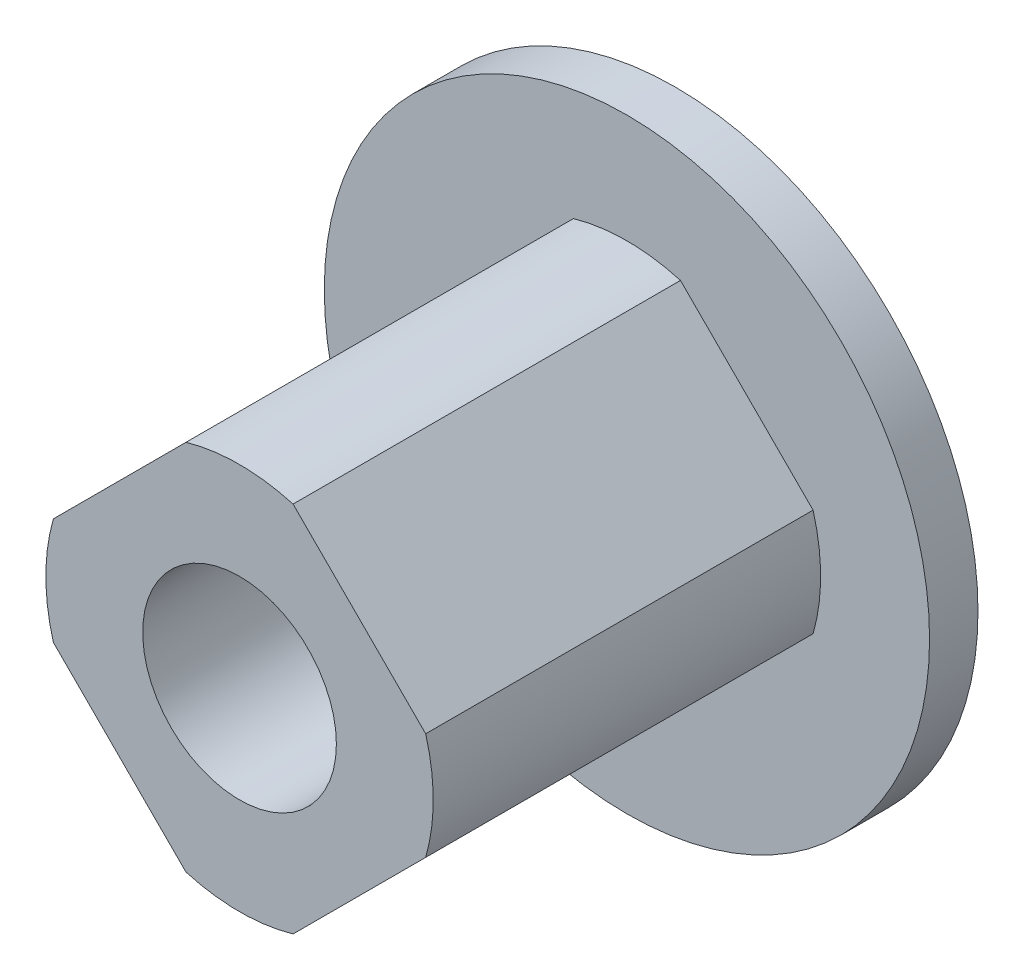
ISO-10303-21;
HEADER;
FILE_DESCRIPTION(('STEP AP214'),'2;1');
FILE_NAME('part.step','',(''),(''),'','','');
FILE_SCHEMA(('AUTOMOTIVE_DESIGN { 1 0 10303 214 1 1 1 1 }'));
ENDSEC;
DATA;
#1=APPLICATION_CONTEXT('core data for automotive mechanical design processes');
#2=APPLICATION_PROTOCOL_DEFINITION('international standard','automotive_design',2000,#1);
#3=PRODUCT_CONTEXT('',#1,'mechanical');
#4=PRODUCT('Part','Part','',(#3));
#5=PRODUCT_RELATED_PRODUCT_CATEGORY('part','',(#4));
#6=PRODUCT_DEFINITION_FORMATION('','',#4);
#7=PRODUCT_DEFINITION_CONTEXT('part definition',#1,'design');
#8=PRODUCT_DEFINITION('design','',#6,#7);
#9=PRODUCT_DEFINITION_SHAPE('','',#8);
#10=(LENGTH_UNIT() NAMED_UNIT(*) SI_UNIT(.MILLI.,.METRE.));
#11=(NAMED_UNIT(*) PLANE_ANGLE_UNIT() SI_UNIT($,.RADIAN.));
#12=(NAMED_UNIT(*) SI_UNIT($,.STERADIAN.) SOLID_ANGLE_UNIT());
#13=UNCERTAINTY_MEASURE_WITH_UNIT(LENGTH_MEASURE(1.E-05),#10,'distance_accuracy_value','');
#14=(GEOMETRIC_REPRESENTATION_CONTEXT(3) GLOBAL_UNCERTAINTY_ASSIGNED_CONTEXT((#13)) GLOBAL_UNIT_ASSIGNED_CONTEXT((#10,
#11,#12)) REPRESENTATION_CONTEXT('',''));
#15=CARTESIAN_POINT('',(0.,0.,0.));
#16=DIRECTION('',(0.,0.,1.));
#17=DIRECTION('',(1.,0.,0.));
#18=AXIS2_PLACEMENT_3D('',#15,#16,#17);
#19=CARTESIAN_POINT('',(0.,0.,31.75));
#20=DIRECTION('',(0.,0.,1.));
#21=DIRECTION('',(1.,0.,0.));
#22=AXIS2_PLACEMENT_3D('',#19,#20,#21);
#23=PLANE('',#22);
#24=CARTESIAN_POINT('',(0.,0.,31.75));
#25=DIRECTION('',(0.,0.,1.));
#26=DIRECTION('',(1.,0.,0.));
#27=AXIS2_PLACEMENT_3D('',#24,#25,#26);
#28=CIRCLE('',#27,6.35);
#29=CARTESIAN_POINT('',(6.35,0.,31.75));
#30=VERTEX_POINT('',#29);
#31=EDGE_CURVE('E167',#30,#30,#28,.T.);
#32=ORIENTED_EDGE('',*,*,#31,.F.);
#33=EDGE_LOOP('',(#32));
#34=FACE_BOUND('',#33,.T.);
#35=CARTESIAN_POINT('',(0.,0.,31.75));
#36=DIRECTION('',(0.,0.,1.));
#37=DIRECTION('',(1.,0.,0.));
#38=AXIS2_PLACEMENT_3D('',#35,#36,#37);
#39=CIRCLE('',#38,12.7);
#40=CARTESIAN_POINT('',(12.2052719061328,-3.51017630573826,31.75));
#41=VERTEX_POINT('',#40);
#42=CARTESIAN_POINT('',(12.2052719061328,3.51017630573825,31.75));
#43=VERTEX_POINT('',#42);
#44=EDGE_CURVE('E151',#41,#43,#39,.T.);
#45=ORIENTED_EDGE('',*,*,#44,.T.);
#46=DIRECTION('',(-0.707106781186548,0.707106781186547,0.));
#47=VECTOR('',#46,1.);
#48=CARTESIAN_POINT('',(15.715448211871,0.,31.75));
#49=LINE('',#48,#47);
#50=CARTESIAN_POINT('',(3.51017630573825,12.2052719061328,31.75));
#51=VERTEX_POINT('',#50);
#52=EDGE_CURVE('E134',#43,#51,#49,.T.);
#53=ORIENTED_EDGE('',*,*,#52,.T.);
#54=CARTESIAN_POINT('',(-3.51017630573825,12.2052719061328,31.75));
#55=VERTEX_POINT('',#54);
#56=EDGE_CURVE('E141',#51,#55,#39,.T.);
#57=ORIENTED_EDGE('',*,*,#56,.T.);
#58=DIRECTION('',(-0.707106781186547,-0.707106781186547,0.));
#59=VECTOR('',#58,1.);
#60=CARTESIAN_POINT('',(0.,15.715448211871,31.75));
#61=LINE('',#60,#59);
#62=CARTESIAN_POINT('',(-12.2052719061328,3.51017630573825,31.75));
#63=VERTEX_POINT('',#62);
#64=EDGE_CURVE('E122',#55,#63,#61,.T.);
#65=ORIENTED_EDGE('',*,*,#64,.T.);
#66=CARTESIAN_POINT('',(-12.2052719061328,-3.51017630573825,31.75));
#67=VERTEX_POINT('',#66);
#68=EDGE_CURVE('E149',#63,#67,#39,.T.);
#69=ORIENTED_EDGE('',*,*,#68,.T.);
#70=DIRECTION('',(0.707106781186547,-0.707106781186548,0.));
#71=VECTOR('',#70,1.);
#72=CARTESIAN_POINT('',(-15.715448211871,0.,31.75));
#73=LINE('',#72,#71);
#74=CARTESIAN_POINT('',(-3.51017630573826,-12.2052719061328,31.75));
#75=VERTEX_POINT('',#74);
#76=EDGE_CURVE('E133',#67,#75,#73,.T.);
#77=ORIENTED_EDGE('',*,*,#76,.T.);
#78=CARTESIAN_POINT('',(3.51017630573826,-12.2052719061328,31.75));
#79=VERTEX_POINT('',#78);
#80=EDGE_CURVE('E155',#75,#79,#39,.T.);
#81=ORIENTED_EDGE('',*,*,#80,.T.);
#82=DIRECTION('',(0.707106781186547,0.707106781186547,0.));
#83=VECTOR('',#82,1.);
#84=CARTESIAN_POINT('',(0.,-15.715448211871,31.75));
#85=LINE('',#84,#83);
#86=EDGE_CURVE('E195',#79,#41,#85,.T.);
#87=ORIENTED_EDGE('',*,*,#86,.T.);
#88=EDGE_LOOP('',(#45,#53,#57,#65,#69,#77,#81,#87));
#89=FACE_BOUND('',#88,.T.);
#90=ADVANCED_FACE('F35',(#34,#89),#23,.T.);
#91=CARTESIAN_POINT('',(0.,0.,31.75));
#92=DIRECTION('',(0.,0.,-1.));
#93=DIRECTION('',(-1.,0.,0.));
#94=AXIS2_PLACEMENT_3D('',#91,#92,#93);
#95=CYLINDRICAL_SURFACE('',#94,12.7);
#96=DIRECTION('',(0.,0.,-1.));
#97=VECTOR('',#96,1.);
#98=CARTESIAN_POINT('',(12.2052719061328,3.51017630573825,31.75));
#99=LINE('',#98,#97);
#100=CARTESIAN_POINT('',(12.2052719061328,3.51017630573825,6.35));
#101=VERTEX_POINT('',#100);
#102=EDGE_CURVE('E11',#43,#101,#99,.T.);
#103=ORIENTED_EDGE('',*,*,#102,.F.);
#104=ORIENTED_EDGE('',*,*,#44,.F.);
#105=DIRECTION('',(0.,0.,-1.));
#106=VECTOR('',#105,1.);
#107=CARTESIAN_POINT('',(12.2052719061328,-3.51017630573826,31.75));
#108=LINE('',#107,#106);
#109=CARTESIAN_POINT('',(12.2052719061328,-3.51017630573826,6.35));
#110=VERTEX_POINT('',#109);
#111=EDGE_CURVE('E225',#110,#41,#108,.F.);
#112=ORIENTED_EDGE('',*,*,#111,.F.);
#113=CARTESIAN_POINT('',(0.,0.,6.35));
#114=DIRECTION('',(0.,0.,1.));
#115=DIRECTION('',(1.,0.,0.));
#116=AXIS2_PLACEMENT_3D('',#113,#114,#115);
#117=CIRCLE('',#116,12.7);
#118=EDGE_CURVE('E162',#110,#101,#117,.T.);
#119=ORIENTED_EDGE('',*,*,#118,.T.);
#120=EDGE_LOOP('',(#103,#104,#112,#119));
#121=FACE_BOUND('',#120,.T.);
#122=ADVANCED_FACE('F234',(#121),#95,.T.);
#123=DIRECTION('',(0.,0.,-1.));
#124=VECTOR('',#123,1.);
#125=CARTESIAN_POINT('',(3.51017630573824,12.2052719061328,31.75));
#126=LINE('',#125,#124);
#127=CARTESIAN_POINT('',(3.51017630573824,12.2052719061328,6.35));
#128=VERTEX_POINT('',#127);
#129=EDGE_CURVE('E43',#128,#51,#126,.F.);
#130=ORIENTED_EDGE('',*,*,#129,.F.);
#131=CARTESIAN_POINT('',(-3.51017630573825,12.2052719061328,6.35));
#132=VERTEX_POINT('',#131);
#133=EDGE_CURVE('E143',#128,#132,#117,.T.);
#134=ORIENTED_EDGE('',*,*,#133,.T.);
#135=DIRECTION('',(0.,0.,-1.));
#136=VECTOR('',#135,1.);
#137=CARTESIAN_POINT('',(-3.51017630573825,12.2052719061328,31.75));
#138=LINE('',#137,#136);
#139=EDGE_CURVE('E125',#55,#132,#138,.T.);
#140=ORIENTED_EDGE('',*,*,#139,.F.);
#141=ORIENTED_EDGE('',*,*,#56,.F.);
#142=EDGE_LOOP('',(#130,#134,#140,#141));
#143=FACE_BOUND('',#142,.T.);
#144=ADVANCED_FACE('F140',(#143),#95,.T.);
#145=DIRECTION('',(0.,0.,-1.));
#146=VECTOR('',#145,1.);
#147=CARTESIAN_POINT('',(3.51017630573826,-12.2052719061328,31.75));
#148=LINE('',#147,#146);
#149=CARTESIAN_POINT('',(3.51017630573826,-12.2052719061328,6.35));
#150=VERTEX_POINT('',#149);
#151=EDGE_CURVE('E209',#79,#150,#148,.T.);
#152=ORIENTED_EDGE('',*,*,#151,.F.);
#153=ORIENTED_EDGE('',*,*,#80,.F.);
#154=DIRECTION('',(0.,0.,-1.));
#155=VECTOR('',#154,1.);
#156=CARTESIAN_POINT('',(-3.51017630573825,-12.2052719061328,31.75));
#157=LINE('',#156,#155);
#158=CARTESIAN_POINT('',(-3.51017630573825,-12.2052719061328,6.35));
#159=VERTEX_POINT('',#158);
#160=EDGE_CURVE('E144',#159,#75,#157,.F.);
#161=ORIENTED_EDGE('',*,*,#160,.F.);
#162=EDGE_CURVE('E164',#159,#150,#117,.T.);
#163=ORIENTED_EDGE('',*,*,#162,.T.);
#164=EDGE_LOOP('',(#152,#153,#161,#163));
#165=FACE_BOUND('',#164,.T.);
#166=ADVANCED_FACE('F232',(#165),#95,.T.);
#167=DIRECTION('',(0.,0.,-1.));
#168=VECTOR('',#167,1.);
#169=CARTESIAN_POINT('',(-12.2052719061328,-3.51017630573824,31.75));
#170=LINE('',#169,#168);
#171=CARTESIAN_POINT('',(-12.2052719061328,-3.51017630573825,6.35));
#172=VERTEX_POINT('',#171);
#173=EDGE_CURVE('E223',#67,#172,#170,.T.);
#174=ORIENTED_EDGE('',*,*,#173,.F.);
#175=ORIENTED_EDGE('',*,*,#68,.F.);
#176=DIRECTION('',(0.,0.,-1.));
#177=VECTOR('',#176,1.);
#178=CARTESIAN_POINT('',(-12.2052719061328,3.51017630573825,31.75));
#179=LINE('',#178,#177);
#180=CARTESIAN_POINT('',(-12.2052719061328,3.51017630573825,6.35));
#181=VERTEX_POINT('',#180);
#182=EDGE_CURVE('E128',#181,#63,#179,.F.);
#183=ORIENTED_EDGE('',*,*,#182,.F.);
#184=EDGE_CURVE('E161',#181,#172,#117,.T.);
#185=ORIENTED_EDGE('',*,*,#184,.T.);
#186=EDGE_LOOP('',(#174,#175,#183,#185));
#187=FACE_BOUND('',#186,.T.);
#188=ADVANCED_FACE('F215',(#187),#95,.T.);
#189=CARTESIAN_POINT('',(0.,0.,6.35));
#190=DIRECTION('',(0.,0.,1.));
#191=DIRECTION('',(1.,0.,0.));
#192=AXIS2_PLACEMENT_3D('',#189,#190,#191);
#193=PLANE('',#192);
#194=DIRECTION('',(-0.707106781186548,0.707106781186547,0.));
#195=VECTOR('',#194,1.);
#196=CARTESIAN_POINT('',(15.715448211871,0.,6.35));
#197=LINE('',#196,#195);
#198=EDGE_CURVE('E197',#101,#128,#197,.T.);
#199=ORIENTED_EDGE('',*,*,#198,.F.);
#200=ORIENTED_EDGE('',*,*,#118,.F.);
#201=DIRECTION('',(0.707106781186547,0.707106781186547,0.));
#202=VECTOR('',#201,1.);
#203=CARTESIAN_POINT('',(0.,-15.715448211871,6.35));
#204=LINE('',#203,#202);
#205=EDGE_CURVE('E50',#150,#110,#204,.T.);
#206=ORIENTED_EDGE('',*,*,#205,.F.);
#207=ORIENTED_EDGE('',*,*,#162,.F.);
#208=DIRECTION('',(0.707106781186547,-0.707106781186548,0.));
#209=VECTOR('',#208,1.);
#210=CARTESIAN_POINT('',(-15.715448211871,0.,6.35));
#211=LINE('',#210,#209);
#212=EDGE_CURVE('E58',#172,#159,#211,.T.);
#213=ORIENTED_EDGE('',*,*,#212,.F.);
#214=ORIENTED_EDGE('',*,*,#184,.F.);
#215=DIRECTION('',(-0.707106781186547,-0.707106781186547,0.));
#216=VECTOR('',#215,1.);
#217=CARTESIAN_POINT('',(0.,15.715448211871,6.35));
#218=LINE('',#217,#216);
#219=EDGE_CURVE('E203',#132,#181,#218,.T.);
#220=ORIENTED_EDGE('',*,*,#219,.F.);
#221=ORIENTED_EDGE('',*,*,#133,.F.);
#222=EDGE_LOOP('',(#199,#200,#206,#207,#213,#214,#220,#221));
#223=FACE_BOUND('',#222,.T.);
#224=CARTESIAN_POINT('',(0.,0.,6.35));
#225=DIRECTION('',(0.,0.,1.));
#226=DIRECTION('',(1.,0.,0.));
#227=AXIS2_PLACEMENT_3D('',#224,#225,#226);
#228=CIRCLE('',#227,19.84375);
#229=CARTESIAN_POINT('',(19.84375,0.,6.35));
#230=VERTEX_POINT('',#229);
#231=EDGE_CURVE('E153',#230,#230,#228,.T.);
#232=ORIENTED_EDGE('',*,*,#231,.T.);
#233=EDGE_LOOP('',(#232));
#234=FACE_BOUND('',#233,.T.);
#235=ADVANCED_FACE('F210',(#223,#234),#193,.T.);
#236=CARTESIAN_POINT('',(0.,0.,0.));
#237=DIRECTION('',(0.,0.,1.));
#238=DIRECTION('',(1.,0.,0.));
#239=AXIS2_PLACEMENT_3D('',#236,#237,#238);
#240=PLANE('',#239);
#241=CARTESIAN_POINT('',(0.,0.,0.));
#242=DIRECTION('',(0.,0.,1.));
#243=DIRECTION('',(1.,0.,0.));
#244=AXIS2_PLACEMENT_3D('',#241,#242,#243);
#245=CIRCLE('',#244,12.7);
#246=CARTESIAN_POINT('',(12.7,0.,0.));
#247=VERTEX_POINT('',#246);
#248=EDGE_CURVE('E410',#247,#247,#245,.T.);
#249=ORIENTED_EDGE('',*,*,#248,.F.);
#250=EDGE_LOOP('',(#249));
#251=FACE_BOUND('',#250,.T.);
#252=DIRECTION('',(1.,0.,0.));
#253=VECTOR('',#252,1.);
#254=CARTESIAN_POINT('',(1.5875,9.525,0.));
#255=LINE('',#254,#253);
#256=CARTESIAN_POINT('',(-1.5875,9.525,0.));
#257=VERTEX_POINT('',#256);
#258=CARTESIAN_POINT('',(1.5875,9.525,0.));
#259=VERTEX_POINT('',#258);
#260=EDGE_CURVE('E185',#257,#259,#255,.T.);
#261=ORIENTED_EDGE('',*,*,#260,.F.);
#262=DIRECTION('',(0.,1.,0.));
#263=VECTOR('',#262,1.);
#264=CARTESIAN_POINT('',(-1.5875,0.,0.));
#265=LINE('',#264,#263);
#266=CARTESIAN_POINT('',(-1.5875,6.14836106210427,0.));
#267=VERTEX_POINT('',#266);
#268=EDGE_CURVE('E188',#267,#257,#265,.T.);
#269=ORIENTED_EDGE('',*,*,#268,.F.);
#270=CARTESIAN_POINT('',(0.,0.,0.));
#271=DIRECTION('',(0.,0.,1.));
#272=DIRECTION('',(1.,0.,0.));
#273=AXIS2_PLACEMENT_3D('',#270,#271,#272);
#274=CIRCLE('',#273,6.35);
#275=CARTESIAN_POINT('',(1.5875,6.14836106210427,0.));
#276=VERTEX_POINT('',#275);
#277=EDGE_CURVE('E424',#267,#276,#274,.T.);
#278=ORIENTED_EDGE('',*,*,#277,.T.);
#279=DIRECTION('',(0.,-1.,0.));
#280=VECTOR('',#279,1.);
#281=CARTESIAN_POINT('',(1.5875,0.,0.));
#282=LINE('',#281,#280);
#283=EDGE_CURVE('E182',#259,#276,#282,.T.);
#284=ORIENTED_EDGE('',*,*,#283,.F.);
#285=EDGE_LOOP('',(#261,#269,#278,#284));
#286=FACE_BOUND('',#285,.T.);
#287=ADVANCED_FACE('F250',(#251,#286),#240,.F.);
#288=CARTESIAN_POINT('',(0.,0.,3.175));
#289=DIRECTION('',(0.,0.,-1.));
#290=DIRECTION('',(-1.,0.,0.));
#291=AXIS2_PLACEMENT_3D('',#288,#289,#290);
#292=CYLINDRICAL_SURFACE('',#291,12.7);
#293=CARTESIAN_POINT('',(0.,0.,3.175));
#294=DIRECTION('',(0.,0.,1.));
#295=DIRECTION('',(1.,0.,0.));
#296=AXIS2_PLACEMENT_3D('',#293,#294,#295);
#297=CIRCLE('',#296,12.7);
#298=CARTESIAN_POINT('',(12.7,0.,3.175));
#299=VERTEX_POINT('',#298);
#300=EDGE_CURVE('E427',#299,#299,#297,.T.);
#301=ORIENTED_EDGE('',*,*,#300,.F.);
#302=EDGE_LOOP('',(#301));
#303=FACE_BOUND('',#302,.T.);
#304=ORIENTED_EDGE('',*,*,#248,.T.);
#305=EDGE_LOOP('',(#304));
#306=FACE_BOUND('',#305,.T.);
#307=ADVANCED_FACE('F37',(#303,#306),#292,.T.);
#308=CARTESIAN_POINT('',(0.,0.,3.175));
#309=DIRECTION('',(0.,0.,-1.));
#310=DIRECTION('',(-1.,0.,0.));
#311=AXIS2_PLACEMENT_3D('',#308,#309,#310);
#312=CYLINDRICAL_SURFACE('',#311,6.35);
#313=DIRECTION('',(0.,0.,-1.));
#314=VECTOR('',#313,1.);
#315=CARTESIAN_POINT('',(-1.5875,6.14836106210427,3.175));
#316=LINE('',#315,#314);
#317=CARTESIAN_POINT('',(-1.5875,6.14836106210427,22.225));
#318=VERTEX_POINT('',#317);
#319=EDGE_CURVE('E216',#318,#267,#316,.T.);
#320=ORIENTED_EDGE('',*,*,#319,.F.);
#321=CARTESIAN_POINT('',(0.,0.,22.225));
#322=DIRECTION('',(0.,0.,1.));
#323=DIRECTION('',(1.,0.,0.));
#324=AXIS2_PLACEMENT_3D('',#321,#322,#323);
#325=CIRCLE('',#324,6.35);
#326=CARTESIAN_POINT('',(1.5875,6.14836106210427,22.225));
#327=VERTEX_POINT('',#326);
#328=EDGE_CURVE('E423',#327,#318,#325,.T.);
#329=ORIENTED_EDGE('',*,*,#328,.F.);
#330=DIRECTION('',(0.,0.,-1.));
#331=VECTOR('',#330,1.);
#332=CARTESIAN_POINT('',(1.5875,6.14836106210427,3.175));
#333=LINE('',#332,#331);
#334=EDGE_CURVE('E218',#276,#327,#333,.F.);
#335=ORIENTED_EDGE('',*,*,#334,.F.);
#336=ORIENTED_EDGE('',*,*,#277,.F.);
#337=EDGE_LOOP('',(#320,#329,#335,#336));
#338=FACE_BOUND('',#337,.T.);
#339=ORIENTED_EDGE('',*,*,#31,.T.);
#340=EDGE_LOOP('',(#339));
#341=FACE_BOUND('',#340,.T.);
#342=ADVANCED_FACE('F323',(#338,#341),#312,.F.);
#343=CARTESIAN_POINT('',(0.,0.,3.175));
#344=DIRECTION('',(0.,0.,1.));
#345=DIRECTION('',(1.,0.,0.));
#346=AXIS2_PLACEMENT_3D('',#343,#344,#345);
#347=PLANE('',#346);
#348=CARTESIAN_POINT('',(0.,0.,3.175));
#349=DIRECTION('',(0.,0.,1.));
#350=DIRECTION('',(1.,0.,0.));
#351=AXIS2_PLACEMENT_3D('',#348,#349,#350);
#352=CIRCLE('',#351,19.84375);
#353=CARTESIAN_POINT('',(19.84375,0.,3.175));
#354=VERTEX_POINT('',#353);
#355=EDGE_CURVE('E148',#354,#354,#352,.T.);
#356=ORIENTED_EDGE('',*,*,#355,.F.);
#357=EDGE_LOOP('',(#356));
#358=FACE_BOUND('',#357,.T.);
#359=ORIENTED_EDGE('',*,*,#300,.T.);
#360=EDGE_LOOP('',(#359));
#361=FACE_BOUND('',#360,.T.);
#362=ADVANCED_FACE('F330',(#358,#361),#347,.F.);
#363=CARTESIAN_POINT('',(0.,0.,6.35));
#364=DIRECTION('',(0.,0.,-1.));
#365=DIRECTION('',(-1.,0.,0.));
#366=AXIS2_PLACEMENT_3D('',#363,#364,#365);
#367=CYLINDRICAL_SURFACE('',#366,19.84375);
#368=ORIENTED_EDGE('',*,*,#231,.F.);
#369=EDGE_LOOP('',(#368));
#370=FACE_BOUND('',#369,.T.);
#371=ORIENTED_EDGE('',*,*,#355,.T.);
#372=EDGE_LOOP('',(#371));
#373=FACE_BOUND('',#372,.T.);
#374=ADVANCED_FACE('F318',(#370,#373),#367,.T.);
#375=CARTESIAN_POINT('',(-1.5875,0.,22.225));
#376=DIRECTION('',(-1.,0.,0.));
#377=DIRECTION('',(0.,0.,1.));
#378=AXIS2_PLACEMENT_3D('',#375,#376,#377);
#379=PLANE('',#378);
#380=ORIENTED_EDGE('',*,*,#319,.T.);
#381=ORIENTED_EDGE('',*,*,#268,.T.);
#382=DIRECTION('',(0.,0.,-1.));
#383=VECTOR('',#382,1.);
#384=CARTESIAN_POINT('',(-1.5875,9.525,22.225));
#385=LINE('',#384,#383);
#386=CARTESIAN_POINT('',(-1.5875,9.525,22.225));
#387=VERTEX_POINT('',#386);
#388=EDGE_CURVE('E176',#387,#257,#385,.T.);
#389=ORIENTED_EDGE('',*,*,#388,.F.);
#390=DIRECTION('',(0.,1.,0.));
#391=VECTOR('',#390,1.);
#392=CARTESIAN_POINT('',(-1.5875,0.,22.225));
#393=LINE('',#392,#391);
#394=EDGE_CURVE('E184',#318,#387,#393,.T.);
#395=ORIENTED_EDGE('',*,*,#394,.F.);
#396=EDGE_LOOP('',(#380,#381,#389,#395));
#397=FACE_BOUND('',#396,.T.);
#398=ADVANCED_FACE('F339',(#397),#379,.F.);
#399=CARTESIAN_POINT('',(1.5875,0.,22.225));
#400=DIRECTION('',(1.,0.,0.));
#401=DIRECTION('',(0.,0.,-1.));
#402=AXIS2_PLACEMENT_3D('',#399,#400,#401);
#403=PLANE('',#402);
#404=ORIENTED_EDGE('',*,*,#334,.T.);
#405=DIRECTION('',(0.,-1.,0.));
#406=VECTOR('',#405,1.);
#407=CARTESIAN_POINT('',(1.5875,0.,22.225));
#408=LINE('',#407,#406);
#409=CARTESIAN_POINT('',(1.5875,9.525,22.225));
#410=VERTEX_POINT('',#409);
#411=EDGE_CURVE('E180',#410,#327,#408,.T.);
#412=ORIENTED_EDGE('',*,*,#411,.F.);
#413=DIRECTION('',(0.,0.,-1.));
#414=VECTOR('',#413,1.);
#415=CARTESIAN_POINT('',(1.5875,9.525,22.225));
#416=LINE('',#415,#414);
#417=EDGE_CURVE('E173',#410,#259,#416,.T.);
#418=ORIENTED_EDGE('',*,*,#417,.T.);
#419=ORIENTED_EDGE('',*,*,#283,.T.);
#420=EDGE_LOOP('',(#404,#412,#418,#419));
#421=FACE_BOUND('',#420,.T.);
#422=ADVANCED_FACE('F344',(#421),#403,.F.);
#423=CARTESIAN_POINT('',(1.5875,9.525,22.225));
#424=DIRECTION('',(0.,1.,0.));
#425=DIRECTION('',(0.,0.,1.));
#426=AXIS2_PLACEMENT_3D('',#423,#424,#425);
#427=PLANE('',#426);
#428=ORIENTED_EDGE('',*,*,#260,.T.);
#429=ORIENTED_EDGE('',*,*,#417,.F.);
#430=DIRECTION('',(1.,0.,0.));
#431=VECTOR('',#430,1.);
#432=CARTESIAN_POINT('',(1.5875,9.525,22.225));
#433=LINE('',#432,#431);
#434=EDGE_CURVE('E191',#387,#410,#433,.T.);
#435=ORIENTED_EDGE('',*,*,#434,.F.);
#436=ORIENTED_EDGE('',*,*,#388,.T.);
#437=EDGE_LOOP('',(#428,#429,#435,#436));
#438=FACE_BOUND('',#437,.T.);
#439=ADVANCED_FACE('F353',(#438),#427,.F.);
#440=CARTESIAN_POINT('',(0.,0.,22.225));
#441=DIRECTION('',(0.,0.,1.));
#442=DIRECTION('',(1.,0.,0.));
#443=AXIS2_PLACEMENT_3D('',#440,#441,#442);
#444=PLANE('',#443);
#445=ORIENTED_EDGE('',*,*,#328,.T.);
#446=ORIENTED_EDGE('',*,*,#394,.T.);
#447=ORIENTED_EDGE('',*,*,#434,.T.);
#448=ORIENTED_EDGE('',*,*,#411,.T.);
#449=EDGE_LOOP('',(#445,#446,#447,#448));
#450=FACE_BOUND('',#449,.T.);
#451=ADVANCED_FACE('F282',(#450),#444,.F.);
#452=CARTESIAN_POINT('',(0.,15.715448211871,6.35));
#453=DIRECTION('',(-0.707106781186548,0.707106781186548,0.));
#454=DIRECTION('',(-0.707106781186548,-0.707106781186548,0.));
#455=AXIS2_PLACEMENT_3D('',#452,#453,#454);
#456=PLANE('',#455);
#457=ORIENTED_EDGE('',*,*,#139,.T.);
#458=ORIENTED_EDGE('',*,*,#219,.T.);
#459=ORIENTED_EDGE('',*,*,#182,.T.);
#460=ORIENTED_EDGE('',*,*,#64,.F.);
#461=EDGE_LOOP('',(#457,#458,#459,#460));
#462=FACE_BOUND('',#461,.T.);
#463=ADVANCED_FACE('F124',(#462),#456,.T.);
#464=CARTESIAN_POINT('',(-15.715448211871,0.,6.35));
#465=DIRECTION('',(-0.707106781186548,-0.707106781186547,0.));
#466=DIRECTION('',(0.707106781186547,-0.707106781186548,0.));
#467=AXIS2_PLACEMENT_3D('',#464,#465,#466);
#468=PLANE('',#467);
#469=ORIENTED_EDGE('',*,*,#173,.T.);
#470=ORIENTED_EDGE('',*,*,#212,.T.);
#471=ORIENTED_EDGE('',*,*,#160,.T.);
#472=ORIENTED_EDGE('',*,*,#76,.F.);
#473=EDGE_LOOP('',(#469,#470,#471,#472));
#474=FACE_BOUND('',#473,.T.);
#475=ADVANCED_FACE('F233',(#474),#468,.T.);
#476=CARTESIAN_POINT('',(0.,-15.715448211871,6.35));
#477=DIRECTION('',(0.707106781186548,-0.707106781186548,0.));
#478=DIRECTION('',(0.707106781186548,0.707106781186548,0.));
#479=AXIS2_PLACEMENT_3D('',#476,#477,#478);
#480=PLANE('',#479);
#481=ORIENTED_EDGE('',*,*,#151,.T.);
#482=ORIENTED_EDGE('',*,*,#205,.T.);
#483=ORIENTED_EDGE('',*,*,#111,.T.);
#484=ORIENTED_EDGE('',*,*,#86,.F.);
#485=EDGE_LOOP('',(#481,#482,#483,#484));
#486=FACE_BOUND('',#485,.T.);
#487=ADVANCED_FACE('F228',(#486),#480,.T.);
#488=CARTESIAN_POINT('',(15.715448211871,0.,6.35));
#489=DIRECTION('',(0.707106781186547,0.707106781186548,0.));
#490=DIRECTION('',(-0.707106781186548,0.707106781186547,0.));
#491=AXIS2_PLACEMENT_3D('',#488,#489,#490);
#492=PLANE('',#491);
#493=ORIENTED_EDGE('',*,*,#102,.T.);
#494=ORIENTED_EDGE('',*,*,#198,.T.);
#495=ORIENTED_EDGE('',*,*,#129,.T.);
#496=ORIENTED_EDGE('',*,*,#52,.F.);
#497=EDGE_LOOP('',(#493,#494,#495,#496));
#498=FACE_BOUND('',#497,.T.);
#499=ADVANCED_FACE('F207',(#498),#492,.T.);
#500=CLOSED_SHELL('',(#90,#122,#144,#166,#188,#235,#287,#307,#342,#362,#374,#398,#422,#439,#451,
#463,#475,#487,#499));
#501=MANIFOLD_SOLID_BREP('B2',#500);
#502=ADVANCED_BREP_SHAPE_REPRESENTATION('',(#18,#501),#14);
#503=SHAPE_DEFINITION_REPRESENTATION(#9,#502);
ENDSEC;
END-ISO-10303-21;
